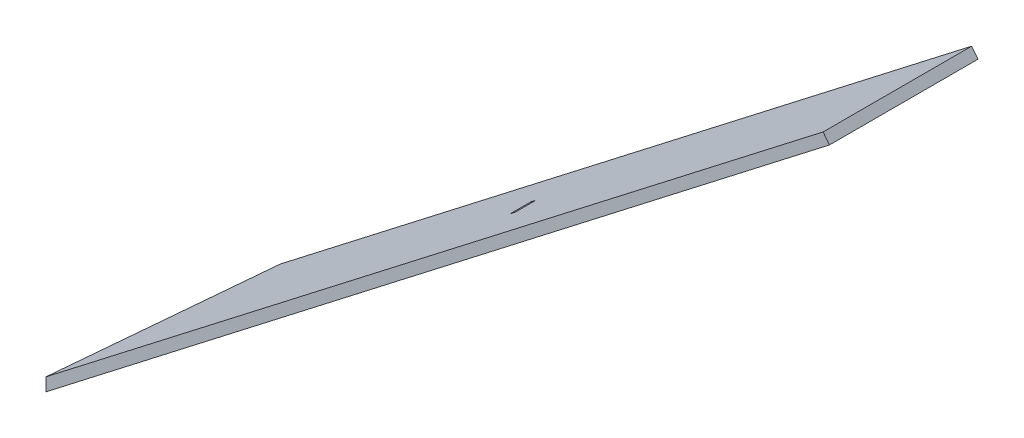
ISO-10303-21;
HEADER;
FILE_DESCRIPTION(('STEP AP214'),'2;1');
FILE_NAME('part.step','',(''),(''),'','','');
FILE_SCHEMA(('AUTOMOTIVE_DESIGN { 1 0 10303 214 1 1 1 1 }'));
ENDSEC;
DATA;
#1=APPLICATION_CONTEXT('core data for automotive mechanical design processes');
#2=APPLICATION_PROTOCOL_DEFINITION('international standard','automotive_design',2000,#1);
#3=PRODUCT_CONTEXT('',#1,'mechanical');
#4=PRODUCT('Part','Part','',(#3));
#5=PRODUCT_RELATED_PRODUCT_CATEGORY('part','',(#4));
#6=PRODUCT_DEFINITION_FORMATION('','',#4);
#7=PRODUCT_DEFINITION_CONTEXT('part definition',#1,'design');
#8=PRODUCT_DEFINITION('design','',#6,#7);
#9=PRODUCT_DEFINITION_SHAPE('','',#8);
#10=(LENGTH_UNIT() NAMED_UNIT(*) SI_UNIT(.MILLI.,.METRE.));
#11=(NAMED_UNIT(*) PLANE_ANGLE_UNIT() SI_UNIT($,.RADIAN.));
#12=(NAMED_UNIT(*) SI_UNIT($,.STERADIAN.) SOLID_ANGLE_UNIT());
#13=UNCERTAINTY_MEASURE_WITH_UNIT(LENGTH_MEASURE(1.E-05),#10,'distance_accuracy_value','');
#14=(GEOMETRIC_REPRESENTATION_CONTEXT(3) GLOBAL_UNCERTAINTY_ASSIGNED_CONTEXT((#13)) GLOBAL_UNIT_ASSIGNED_CONTEXT((#10,
#11,#12)) REPRESENTATION_CONTEXT('',''));
#15=CARTESIAN_POINT('',(0.,0.,0.));
#16=DIRECTION('',(0.,0.,1.));
#17=DIRECTION('',(1.,0.,0.));
#18=AXIS2_PLACEMENT_3D('',#15,#16,#17);
#19=CARTESIAN_POINT('',(0.,6.31932670309673,-240.2));
#20=DIRECTION('',(-0.611527040185833,0.791223532967489,0.));
#21=DIRECTION('',(-0.791223532967489,-0.611527040185833,0.));
#22=AXIS2_PLACEMENT_3D('',#19,#20,#21);
#23=PLANE('',#22);
#24=DIRECTION('',(0.,0.,1.));
#25=VECTOR('',#24,1.);
#26=CARTESIAN_POINT('',(194.180323279044,156.398935573933,-240.2));
#27=LINE('',#26,#25);
#28=CARTESIAN_POINT('',(194.180323279044,156.398935573933,-209.17));
#29=VERTEX_POINT('',#28);
#30=CARTESIAN_POINT('',(194.180323279044,156.398935573933,-199.17));
#31=VERTEX_POINT('',#30);
#32=EDGE_CURVE('E273',#29,#31,#27,.T.);
#33=ORIENTED_EDGE('',*,*,#32,.F.);
#34=DIRECTION('',(-0.791223532967489,-0.611527040185833,0.));
#35=VECTOR('',#34,1.);
#36=CARTESIAN_POINT('',(-2.51217831055972E-13,6.31932670309655,-209.170000000002));
#37=LINE('',#36,#35);
#38=CARTESIAN_POINT('',(196.553993877946,158.23351669449,-209.17));
#39=VERTEX_POINT('',#38);
#40=EDGE_CURVE('E269',#39,#29,#37,.T.);
#41=ORIENTED_EDGE('',*,*,#40,.F.);
#42=DIRECTION('',(0.,0.,-1.));
#43=VECTOR('',#42,1.);
#44=CARTESIAN_POINT('',(196.553993877946,158.23351669449,-240.2));
#45=LINE('',#44,#43);
#46=CARTESIAN_POINT('',(196.553993877946,158.23351669449,-199.17));
#47=VERTEX_POINT('',#46);
#48=EDGE_CURVE('E254',#47,#39,#45,.T.);
#49=ORIENTED_EDGE('',*,*,#48,.F.);
#50=DIRECTION('',(0.791223532967489,0.611527040185833,0.));
#51=VECTOR('',#50,1.);
#52=CARTESIAN_POINT('',(2.76282136591466E-13,6.31932670309696,-199.169999999998));
#53=LINE('',#52,#51);
#54=EDGE_CURVE('E248',#31,#47,#53,.T.);
#55=ORIENTED_EDGE('',*,*,#54,.F.);
#56=EDGE_LOOP('',(#33,#41,#49,#55));
#57=FACE_BOUND('',#56,.T.);
#58=DIRECTION('',(-0.791223532967489,-0.611527040185833,0.));
#59=VECTOR('',#58,1.);
#60=CARTESIAN_POINT('',(0.,6.31932670309673,-240.2));
#61=LINE('',#60,#59);
#62=CARTESIAN_POINT('',(376.967027683356,297.672555066093,-240.2));
#63=VERTEX_POINT('',#62);
#64=CARTESIAN_POINT('',(41.6038603978038,38.4744441247862,-240.2));
#65=VERTEX_POINT('',#64);
#66=EDGE_CURVE('E305',#63,#65,#61,.T.);
#67=ORIENTED_EDGE('',*,*,#66,.T.);
#68=DIRECTION('',(-0.466386479127677,-0.360464434233858,0.807805077812311));
#69=VECTOR('',#68,1.);
#70=CARTESIAN_POINT('',(27.1485593184524,27.3021178279468,-215.162684091858));
#71=LINE('',#70,#69);
#72=CARTESIAN_POINT('',(0.,6.31932670309682,-168.14));
#73=VERTEX_POINT('',#72);
#74=EDGE_CURVE('E286',#65,#73,#71,.T.);
#75=ORIENTED_EDGE('',*,*,#74,.T.);
#76=DIRECTION('',(0.791223532967489,0.611527040185833,0.));
#77=VECTOR('',#76,1.);
#78=CARTESIAN_POINT('',(0.,6.31932670309673,-168.14));
#79=LINE('',#78,#77);
#80=CARTESIAN_POINT('',(376.967027683356,297.672555066093,-168.14));
#81=VERTEX_POINT('',#80);
#82=EDGE_CURVE('E294',#73,#81,#79,.T.);
#83=ORIENTED_EDGE('',*,*,#82,.T.);
#84=DIRECTION('',(0.,0.,1.));
#85=VECTOR('',#84,1.);
#86=CARTESIAN_POINT('',(376.967027683356,297.672555066093,-240.2));
#87=LINE('',#86,#85);
#88=EDGE_CURVE('E310',#63,#81,#87,.T.);
#89=ORIENTED_EDGE('',*,*,#88,.F.);
#90=EDGE_LOOP('',(#67,#75,#83,#89));
#91=FACE_BOUND('',#90,.T.);
#92=ADVANCED_FACE('F186',(#57,#91),#23,.T.);
#93=CARTESIAN_POINT('',(0.,0.,-240.2));
#94=DIRECTION('',(0.611527040185833,-0.791223532967489,0.));
#95=DIRECTION('',(0.791223532967489,0.611527040185833,0.));
#96=AXIS2_PLACEMENT_3D('',#93,#94,#95);
#97=PLANE('',#96);
#98=DIRECTION('',(0.,0.,-1.));
#99=VECTOR('',#98,1.);
#100=CARTESIAN_POINT('',(197.237958479973,152.442817909095,-240.2));
#101=LINE('',#100,#99);
#102=CARTESIAN_POINT('',(197.237958479973,152.442817909095,-199.17));
#103=VERTEX_POINT('',#102);
#104=CARTESIAN_POINT('',(197.237958479973,152.442817909095,-209.17));
#105=VERTEX_POINT('',#104);
#106=EDGE_CURVE('E13',#103,#105,#101,.T.);
#107=ORIENTED_EDGE('',*,*,#106,.F.);
#108=DIRECTION('',(-0.791223532967489,-0.611527040185833,0.));
#109=VECTOR('',#108,1.);
#110=CARTESIAN_POINT('',(3.00351424820644E-13,2.3213796125009E-13,-199.169999999998));
#111=LINE('',#110,#109);
#112=CARTESIAN_POINT('',(199.611629078876,154.277399029653,-199.17));
#113=VERTEX_POINT('',#112);
#114=EDGE_CURVE('E325',#113,#103,#111,.T.);
#115=ORIENTED_EDGE('',*,*,#114,.F.);
#116=DIRECTION('',(0.,0.,1.));
#117=VECTOR('',#116,1.);
#118=CARTESIAN_POINT('',(199.611629078875,154.277399029653,-240.2));
#119=LINE('',#118,#117);
#120=CARTESIAN_POINT('',(199.611629078876,154.277399029653,-209.17));
#121=VERTEX_POINT('',#120);
#122=EDGE_CURVE('E262',#121,#113,#119,.T.);
#123=ORIENTED_EDGE('',*,*,#122,.F.);
#124=DIRECTION('',(0.791223532967489,0.611527040185833,0.));
#125=VECTOR('',#124,1.);
#126=CARTESIAN_POINT('',(-2.27148542826794E-13,-1.7556034456713E-13,-209.170000000002));
#127=LINE('',#126,#125);
#128=EDGE_CURVE('E195',#105,#121,#127,.T.);
#129=ORIENTED_EDGE('',*,*,#128,.F.);
#130=EDGE_LOOP('',(#107,#115,#123,#129));
#131=FACE_BOUND('',#130,.T.);
#132=DIRECTION('',(-0.791223532967489,-0.611527040185833,0.));
#133=VECTOR('',#132,1.);
#134=CARTESIAN_POINT('',(0.,0.,-168.14));
#135=LINE('',#134,#133);
#136=CARTESIAN_POINT('',(380.024662884285,293.716437401255,-168.14));
#137=VERTEX_POINT('',#136);
#138=CARTESIAN_POINT('',(0.,0.,-168.14));
#139=VERTEX_POINT('',#138);
#140=EDGE_CURVE('E314',#137,#139,#135,.T.);
#141=ORIENTED_EDGE('',*,*,#140,.T.);
#142=DIRECTION('',(0.466386479127677,0.360464434233858,-0.807805077812311));
#143=VECTOR('',#142,1.);
#144=CARTESIAN_POINT('',(27.1485593184524,20.9827911248501,-215.162684091858));
#145=LINE('',#144,#143);
#146=CARTESIAN_POINT('',(41.6038603978038,32.1551174216895,-240.2));
#147=VERTEX_POINT('',#146);
#148=EDGE_CURVE('E282',#139,#147,#145,.T.);
#149=ORIENTED_EDGE('',*,*,#148,.T.);
#150=DIRECTION('',(0.791223532967489,0.611527040185833,0.));
#151=VECTOR('',#150,1.);
#152=CARTESIAN_POINT('',(0.,0.,-240.2));
#153=LINE('',#152,#151);
#154=CARTESIAN_POINT('',(380.024662884285,293.716437401255,-240.2));
#155=VERTEX_POINT('',#154);
#156=EDGE_CURVE('E298',#147,#155,#153,.T.);
#157=ORIENTED_EDGE('',*,*,#156,.T.);
#158=DIRECTION('',(0.,0.,1.));
#159=VECTOR('',#158,1.);
#160=CARTESIAN_POINT('',(380.024662884285,293.716437401255,-240.2));
#161=LINE('',#160,#159);
#162=EDGE_CURVE('E309',#155,#137,#161,.T.);
#163=ORIENTED_EDGE('',*,*,#162,.T.);
#164=EDGE_LOOP('',(#141,#149,#157,#163));
#165=FACE_BOUND('',#164,.T.);
#166=ADVANCED_FACE('F188',(#131,#165),#97,.T.);
#167=CARTESIAN_POINT('',(0.,0.,-240.2));
#168=DIRECTION('',(0.,0.,-1.));
#169=DIRECTION('',(-1.,0.,0.));
#170=AXIS2_PLACEMENT_3D('',#167,#168,#169);
#171=PLANE('',#170);
#172=ORIENTED_EDGE('',*,*,#156,.F.);
#173=DIRECTION('',(0.,-1.,0.));
#174=VECTOR('',#173,1.);
#175=CARTESIAN_POINT('',(41.6038603978038,297.672555066093,-240.2));
#176=LINE('',#175,#174);
#177=EDGE_CURVE('E279',#65,#147,#176,.T.);
#178=ORIENTED_EDGE('',*,*,#177,.F.);
#179=ORIENTED_EDGE('',*,*,#66,.F.);
#180=DIRECTION('',(-0.611527040185814,0.791223532967504,0.));
#181=VECTOR('',#180,1.);
#182=CARTESIAN_POINT('',(380.024662884285,293.716437401255,-240.2));
#183=LINE('',#182,#181);
#184=EDGE_CURVE('E301',#155,#63,#183,.T.);
#185=ORIENTED_EDGE('',*,*,#184,.F.);
#186=EDGE_LOOP('',(#172,#178,#179,#185));
#187=FACE_BOUND('',#186,.T.);
#188=ADVANCED_FACE('F362',(#187),#171,.T.);
#189=CARTESIAN_POINT('',(0.,297.672555066093,-168.14));
#190=DIRECTION('',(0.,0.,1.));
#191=DIRECTION('',(1.,0.,0.));
#192=AXIS2_PLACEMENT_3D('',#189,#190,#191);
#193=PLANE('',#192);
#194=ORIENTED_EDGE('',*,*,#82,.F.);
#195=DIRECTION('',(0.,-1.,0.));
#196=VECTOR('',#195,1.);
#197=CARTESIAN_POINT('',(0.,297.672555066093,-168.14));
#198=LINE('',#197,#196);
#199=EDGE_CURVE('E321',#73,#139,#198,.T.);
#200=ORIENTED_EDGE('',*,*,#199,.T.);
#201=ORIENTED_EDGE('',*,*,#140,.F.);
#202=DIRECTION('',(0.611527040185814,-0.791223532967504,0.));
#203=VECTOR('',#202,1.);
#204=CARTESIAN_POINT('',(380.024662884285,293.716437401255,-168.14));
#205=LINE('',#204,#203);
#206=EDGE_CURVE('E290',#81,#137,#205,.T.);
#207=ORIENTED_EDGE('',*,*,#206,.F.);
#208=EDGE_LOOP('',(#194,#200,#201,#207));
#209=FACE_BOUND('',#208,.T.);
#210=ADVANCED_FACE('F366',(#209),#193,.T.);
#211=CARTESIAN_POINT('',(380.024662884285,293.716437401255,-240.2));
#212=DIRECTION('',(0.791223532967503,0.611527040185814,0.));
#213=DIRECTION('',(-0.611527040185814,0.791223532967504,0.));
#214=AXIS2_PLACEMENT_3D('',#211,#212,#213);
#215=PLANE('',#214);
#216=ORIENTED_EDGE('',*,*,#88,.T.);
#217=ORIENTED_EDGE('',*,*,#206,.T.);
#218=ORIENTED_EDGE('',*,*,#162,.F.);
#219=ORIENTED_EDGE('',*,*,#184,.T.);
#220=EDGE_LOOP('',(#216,#217,#218,#219));
#221=FACE_BOUND('',#220,.T.);
#222=ADVANCED_FACE('F353',(#221),#215,.T.);
#223=CARTESIAN_POINT('',(-72.8067556961572,297.672555066093,-42.0349999999991));
#224=DIRECTION('',(-0.866025403784442,0.,-0.499999999999994));
#225=DIRECTION('',(-0.499999999999994,0.,0.866025403784442));
#226=AXIS2_PLACEMENT_3D('',#223,#224,#225);
#227=PLANE('',#226);
#228=ORIENTED_EDGE('',*,*,#177,.T.);
#229=ORIENTED_EDGE('',*,*,#148,.F.);
#230=ORIENTED_EDGE('',*,*,#199,.F.);
#231=ORIENTED_EDGE('',*,*,#74,.F.);
#232=EDGE_LOOP('',(#228,#229,#230,#231));
#233=FACE_BOUND('',#232,.T.);
#234=ADVANCED_FACE('F346',(#233),#227,.T.);
#235=CARTESIAN_POINT('',(339.354003477218,-31.4338577321258,-199.17));
#236=DIRECTION('',(-0.791223532967489,-0.611527040185833,0.));
#237=DIRECTION('',(0.611527040185833,-0.791223532967489,0.));
#238=AXIS2_PLACEMENT_3D('',#235,#236,#237);
#239=PLANE('',#238);
#240=ORIENTED_EDGE('',*,*,#32,.T.);
#241=DIRECTION('',(-0.611527040185833,0.791223532967489,0.));
#242=VECTOR('',#241,1.);
#243=CARTESIAN_POINT('',(339.354003477218,-31.4338577321258,-199.17));
#244=LINE('',#243,#242);
#245=EDGE_CURVE('E202',#103,#31,#244,.T.);
#246=ORIENTED_EDGE('',*,*,#245,.F.);
#247=ORIENTED_EDGE('',*,*,#106,.T.);
#248=DIRECTION('',(-0.611527040185833,0.791223532967489,0.));
#249=VECTOR('',#248,1.);
#250=CARTESIAN_POINT('',(339.354003477218,-31.4338577321258,-209.17));
#251=LINE('',#250,#249);
#252=EDGE_CURVE('E255',#105,#29,#251,.T.);
#253=ORIENTED_EDGE('',*,*,#252,.T.);
#254=EDGE_LOOP('',(#240,#246,#247,#253));
#255=FACE_BOUND('',#254,.T.);
#256=ADVANCED_FACE('F341',(#255),#239,.F.);
#257=CARTESIAN_POINT('',(339.354003477218,-31.4338577321258,-209.17));
#258=DIRECTION('',(0.,0.,-1.));
#259=DIRECTION('',(-1.,0.,0.));
#260=AXIS2_PLACEMENT_3D('',#257,#258,#259);
#261=PLANE('',#260);
#262=ORIENTED_EDGE('',*,*,#40,.T.);
#263=ORIENTED_EDGE('',*,*,#252,.F.);
#264=ORIENTED_EDGE('',*,*,#128,.T.);
#265=DIRECTION('',(-0.611527040185833,0.791223532967489,0.));
#266=VECTOR('',#265,1.);
#267=CARTESIAN_POINT('',(341.72767407612,-29.5992766115684,-209.17));
#268=LINE('',#267,#266);
#269=EDGE_CURVE('E265',#121,#39,#268,.T.);
#270=ORIENTED_EDGE('',*,*,#269,.T.);
#271=EDGE_LOOP('',(#262,#263,#264,#270));
#272=FACE_BOUND('',#271,.T.);
#273=ADVANCED_FACE('F333',(#272),#261,.F.);
#274=CARTESIAN_POINT('',(341.72767407612,-29.5992766115684,-199.17));
#275=DIRECTION('',(0.791223532967489,0.611527040185833,0.));
#276=DIRECTION('',(-0.611527040185833,0.791223532967489,0.));
#277=AXIS2_PLACEMENT_3D('',#274,#275,#276);
#278=PLANE('',#277);
#279=ORIENTED_EDGE('',*,*,#48,.T.);
#280=ORIENTED_EDGE('',*,*,#269,.F.);
#281=ORIENTED_EDGE('',*,*,#122,.T.);
#282=DIRECTION('',(-0.611527040185833,0.791223532967489,0.));
#283=VECTOR('',#282,1.);
#284=CARTESIAN_POINT('',(341.72767407612,-29.5992766115684,-199.17));
#285=LINE('',#284,#283);
#286=EDGE_CURVE('E207',#113,#47,#285,.T.);
#287=ORIENTED_EDGE('',*,*,#286,.T.);
#288=EDGE_LOOP('',(#279,#280,#281,#287));
#289=FACE_BOUND('',#288,.T.);
#290=ADVANCED_FACE('F258',(#289),#278,.F.);
#291=CARTESIAN_POINT('',(339.354003477218,-31.4338577321258,-199.17));
#292=DIRECTION('',(0.,0.,1.));
#293=DIRECTION('',(1.,0.,0.));
#294=AXIS2_PLACEMENT_3D('',#291,#292,#293);
#295=PLANE('',#294);
#296=ORIENTED_EDGE('',*,*,#54,.T.);
#297=ORIENTED_EDGE('',*,*,#286,.F.);
#298=ORIENTED_EDGE('',*,*,#114,.T.);
#299=ORIENTED_EDGE('',*,*,#245,.T.);
#300=EDGE_LOOP('',(#296,#297,#298,#299));
#301=FACE_BOUND('',#300,.T.);
#302=ADVANCED_FACE('F249',(#301),#295,.F.);
#303=CLOSED_SHELL('',(#92,#166,#188,#210,#222,#234,#256,#273,#290,#302));
#304=MANIFOLD_SOLID_BREP('B2',#303);
#305=ADVANCED_BREP_SHAPE_REPRESENTATION('',(#18,#304),#14);
#306=SHAPE_DEFINITION_REPRESENTATION(#9,#305);
ENDSEC;
END-ISO-10303-21;
